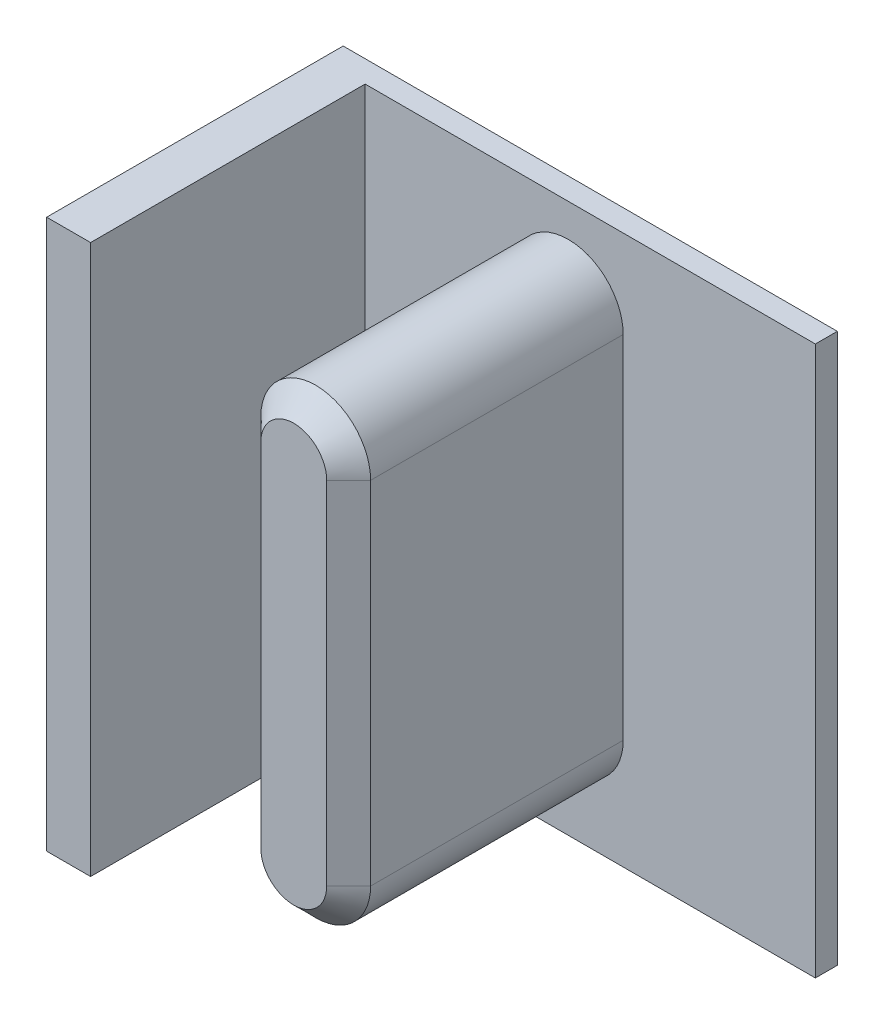
ISO-10303-21;
HEADER;
FILE_DESCRIPTION(('STEP AP214'),'2;1');
FILE_NAME('part.step','',(''),(''),'','','');
FILE_SCHEMA(('AUTOMOTIVE_DESIGN { 1 0 10303 214 1 1 1 1 }'));
ENDSEC;
DATA;
#1=APPLICATION_CONTEXT('core data for automotive mechanical design processes');
#2=APPLICATION_PROTOCOL_DEFINITION('international standard','automotive_design',2000,#1);
#3=PRODUCT_CONTEXT('',#1,'mechanical');
#4=PRODUCT('Part','Part','',(#3));
#5=PRODUCT_RELATED_PRODUCT_CATEGORY('part','',(#4));
#6=PRODUCT_DEFINITION_FORMATION('','',#4);
#7=PRODUCT_DEFINITION_CONTEXT('part definition',#1,'design');
#8=PRODUCT_DEFINITION('design','',#6,#7);
#9=PRODUCT_DEFINITION_SHAPE('','',#8);
#10=(LENGTH_UNIT() NAMED_UNIT(*) SI_UNIT(.MILLI.,.METRE.));
#11=(NAMED_UNIT(*) PLANE_ANGLE_UNIT() SI_UNIT($,.RADIAN.));
#12=(NAMED_UNIT(*) SI_UNIT($,.STERADIAN.) SOLID_ANGLE_UNIT());
#13=UNCERTAINTY_MEASURE_WITH_UNIT(LENGTH_MEASURE(1.E-05),#10,'distance_accuracy_value','');
#14=(GEOMETRIC_REPRESENTATION_CONTEXT(3) GLOBAL_UNCERTAINTY_ASSIGNED_CONTEXT((#13)) GLOBAL_UNIT_ASSIGNED_CONTEXT((#10,
#11,#12)) REPRESENTATION_CONTEXT('',''));
#15=CARTESIAN_POINT('',(0.,0.,0.));
#16=DIRECTION('',(0.,0.,1.));
#17=DIRECTION('',(1.,0.,0.));
#18=AXIS2_PLACEMENT_3D('',#15,#16,#17);
#19=CARTESIAN_POINT('',(0.,0.,0.4));
#20=DIRECTION('',(0.,0.,-1.));
#21=DIRECTION('',(-1.,0.,0.));
#22=AXIS2_PLACEMENT_3D('',#19,#20,#21);
#23=PLANE('',#22);
#24=CARTESIAN_POINT('',(4.5,2.,0.4));
#25=DIRECTION('',(0.,0.,1.));
#26=DIRECTION('',(1.,0.,0.));
#27=AXIS2_PLACEMENT_3D('',#24,#25,#26);
#28=CIRCLE('',#27,1.);
#29=CARTESIAN_POINT('',(3.5,2.,0.4));
#30=VERTEX_POINT('',#29);
#31=CARTESIAN_POINT('',(5.5,2.,0.4));
#32=VERTEX_POINT('',#31);
#33=EDGE_CURVE('E161',#30,#32,#28,.T.);
#34=ORIENTED_EDGE('',*,*,#33,.F.);
#35=DIRECTION('',(0.,-1.,0.));
#36=VECTOR('',#35,1.);
#37=CARTESIAN_POINT('',(3.5,2.,0.4));
#38=LINE('',#37,#36);
#39=CARTESIAN_POINT('',(3.5,8.4,0.4));
#40=VERTEX_POINT('',#39);
#41=EDGE_CURVE('E170',#40,#30,#38,.T.);
#42=ORIENTED_EDGE('',*,*,#41,.F.);
#43=CARTESIAN_POINT('',(4.5,8.4,0.4));
#44=DIRECTION('',(0.,0.,1.));
#45=DIRECTION('',(1.,0.,0.));
#46=AXIS2_PLACEMENT_3D('',#43,#44,#45);
#47=CIRCLE('',#46,1.);
#48=CARTESIAN_POINT('',(5.5,8.4,0.4));
#49=VERTEX_POINT('',#48);
#50=EDGE_CURVE('E167',#49,#40,#47,.T.);
#51=ORIENTED_EDGE('',*,*,#50,.F.);
#52=DIRECTION('',(0.,1.,0.));
#53=VECTOR('',#52,1.);
#54=CARTESIAN_POINT('',(5.5,2.,0.4));
#55=LINE('',#54,#53);
#56=EDGE_CURVE('E164',#32,#49,#55,.T.);
#57=ORIENTED_EDGE('',*,*,#56,.F.);
#58=EDGE_LOOP('',(#34,#42,#51,#57));
#59=FACE_BOUND('',#58,.T.);
#60=DIRECTION('',(0.,1.,0.));
#61=VECTOR('',#60,1.);
#62=CARTESIAN_POINT('',(0.8,10.,0.4));
#63=LINE('',#62,#61);
#64=CARTESIAN_POINT('',(0.800000000000001,0.,0.4));
#65=VERTEX_POINT('',#64);
#66=CARTESIAN_POINT('',(0.800000000000001,10.,0.4));
#67=VERTEX_POINT('',#66);
#68=EDGE_CURVE('E150',#65,#67,#63,.T.);
#69=ORIENTED_EDGE('',*,*,#68,.F.);
#70=DIRECTION('',(1.,0.,0.));
#71=VECTOR('',#70,1.);
#72=CARTESIAN_POINT('',(0.,0.,0.4));
#73=LINE('',#72,#71);
#74=CARTESIAN_POINT('',(9.,0.,0.4));
#75=VERTEX_POINT('',#74);
#76=EDGE_CURVE('E181',#65,#75,#73,.T.);
#77=ORIENTED_EDGE('',*,*,#76,.T.);
#78=DIRECTION('',(0.,1.,0.));
#79=VECTOR('',#78,1.);
#80=CARTESIAN_POINT('',(9.,0.,0.4));
#81=LINE('',#80,#79);
#82=CARTESIAN_POINT('',(9.,10.,0.4));
#83=VERTEX_POINT('',#82);
#84=EDGE_CURVE('E183',#75,#83,#81,.T.);
#85=ORIENTED_EDGE('',*,*,#84,.T.);
#86=DIRECTION('',(-1.,0.,0.));
#87=VECTOR('',#86,1.);
#88=CARTESIAN_POINT('',(0.,10.,0.4));
#89=LINE('',#88,#87);
#90=EDGE_CURVE('E186',#83,#67,#89,.T.);
#91=ORIENTED_EDGE('',*,*,#90,.T.);
#92=EDGE_LOOP('',(#69,#77,#85,#91));
#93=FACE_BOUND('',#92,.T.);
#94=ADVANCED_FACE('F33',(#59,#93),#23,.F.);
#95=CARTESIAN_POINT('',(0.,0.,0.4));
#96=DIRECTION('',(1.,0.,0.));
#97=DIRECTION('',(0.,0.,-1.));
#98=AXIS2_PLACEMENT_3D('',#95,#96,#97);
#99=PLANE('',#98);
#100=DIRECTION('',(0.,-1.,0.));
#101=VECTOR('',#100,1.);
#102=CARTESIAN_POINT('',(0.,0.,0.));
#103=LINE('',#102,#101);
#104=CARTESIAN_POINT('',(0.,10.,0.));
#105=VERTEX_POINT('',#104);
#106=CARTESIAN_POINT('',(0.,0.,0.));
#107=VERTEX_POINT('',#106);
#108=EDGE_CURVE('E131',#105,#107,#103,.T.);
#109=ORIENTED_EDGE('',*,*,#108,.T.);
#110=DIRECTION('',(0.,0.,-1.));
#111=VECTOR('',#110,1.);
#112=CARTESIAN_POINT('',(0.,0.,0.4));
#113=LINE('',#112,#111);
#114=CARTESIAN_POINT('',(0.,0.,5.4));
#115=VERTEX_POINT('',#114);
#116=EDGE_CURVE('E124',#115,#107,#113,.T.);
#117=ORIENTED_EDGE('',*,*,#116,.F.);
#118=DIRECTION('',(0.,-1.,0.));
#119=VECTOR('',#118,1.);
#120=CARTESIAN_POINT('',(0.,10.,5.4));
#121=LINE('',#120,#119);
#122=CARTESIAN_POINT('',(0.,10.,5.4));
#123=VERTEX_POINT('',#122);
#124=EDGE_CURVE('E129',#123,#115,#121,.T.);
#125=ORIENTED_EDGE('',*,*,#124,.F.);
#126=DIRECTION('',(0.,0.,-1.));
#127=VECTOR('',#126,1.);
#128=CARTESIAN_POINT('',(0.,10.,0.4));
#129=LINE('',#128,#127);
#130=EDGE_CURVE('E188',#123,#105,#129,.T.);
#131=ORIENTED_EDGE('',*,*,#130,.T.);
#132=EDGE_LOOP('',(#109,#117,#125,#131));
#133=FACE_BOUND('',#132,.T.);
#134=ADVANCED_FACE('F126',(#133),#99,.F.);
#135=CARTESIAN_POINT('',(0.,0.,0.4));
#136=DIRECTION('',(0.,1.,0.));
#137=DIRECTION('',(0.,0.,1.));
#138=AXIS2_PLACEMENT_3D('',#135,#136,#137);
#139=PLANE('',#138);
#140=DIRECTION('',(1.,0.,0.));
#141=VECTOR('',#140,1.);
#142=CARTESIAN_POINT('',(0.,0.,0.));
#143=LINE('',#142,#141);
#144=CARTESIAN_POINT('',(9.,0.,0.));
#145=VERTEX_POINT('',#144);
#146=EDGE_CURVE('E190',#107,#145,#143,.T.);
#147=ORIENTED_EDGE('',*,*,#146,.T.);
#148=DIRECTION('',(0.,0.,-1.));
#149=VECTOR('',#148,1.);
#150=CARTESIAN_POINT('',(9.,0.,0.4));
#151=LINE('',#150,#149);
#152=EDGE_CURVE('E134',#75,#145,#151,.T.);
#153=ORIENTED_EDGE('',*,*,#152,.F.);
#154=ORIENTED_EDGE('',*,*,#76,.F.);
#155=DIRECTION('',(0.,0.,-1.));
#156=VECTOR('',#155,1.);
#157=CARTESIAN_POINT('',(0.800000000000001,0.,5.4));
#158=LINE('',#157,#156);
#159=CARTESIAN_POINT('',(0.800000000000001,0.,5.4));
#160=VERTEX_POINT('',#159);
#161=EDGE_CURVE('E141',#160,#65,#158,.T.);
#162=ORIENTED_EDGE('',*,*,#161,.F.);
#163=DIRECTION('',(1.,0.,0.));
#164=VECTOR('',#163,1.);
#165=CARTESIAN_POINT('',(0.,0.,5.4));
#166=LINE('',#165,#164);
#167=EDGE_CURVE('E137',#115,#160,#166,.T.);
#168=ORIENTED_EDGE('',*,*,#167,.F.);
#169=ORIENTED_EDGE('',*,*,#116,.T.);
#170=EDGE_LOOP('',(#147,#153,#154,#162,#168,#169));
#171=FACE_BOUND('',#170,.T.);
#172=ADVANCED_FACE('F138',(#171),#139,.F.);
#173=CARTESIAN_POINT('',(9.,0.,0.4));
#174=DIRECTION('',(-1.,0.,0.));
#175=DIRECTION('',(0.,0.,1.));
#176=AXIS2_PLACEMENT_3D('',#173,#174,#175);
#177=PLANE('',#176);
#178=DIRECTION('',(0.,1.,0.));
#179=VECTOR('',#178,1.);
#180=CARTESIAN_POINT('',(9.,0.,0.));
#181=LINE('',#180,#179);
#182=CARTESIAN_POINT('',(9.,10.,0.));
#183=VERTEX_POINT('',#182);
#184=EDGE_CURVE('E192',#145,#183,#181,.T.);
#185=ORIENTED_EDGE('',*,*,#184,.T.);
#186=DIRECTION('',(0.,0.,-1.));
#187=VECTOR('',#186,1.);
#188=CARTESIAN_POINT('',(9.,10.,0.4));
#189=LINE('',#188,#187);
#190=EDGE_CURVE('E196',#83,#183,#189,.T.);
#191=ORIENTED_EDGE('',*,*,#190,.F.);
#192=ORIENTED_EDGE('',*,*,#84,.F.);
#193=ORIENTED_EDGE('',*,*,#152,.T.);
#194=EDGE_LOOP('',(#185,#191,#192,#193));
#195=FACE_BOUND('',#194,.T.);
#196=ADVANCED_FACE('F275',(#195),#177,.F.);
#197=CARTESIAN_POINT('',(0.,10.,0.4));
#198=DIRECTION('',(0.,-1.,0.));
#199=DIRECTION('',(0.,0.,-1.));
#200=AXIS2_PLACEMENT_3D('',#197,#198,#199);
#201=PLANE('',#200);
#202=DIRECTION('',(-1.,0.,0.));
#203=VECTOR('',#202,1.);
#204=CARTESIAN_POINT('',(0.,10.,0.));
#205=LINE('',#204,#203);
#206=EDGE_CURVE('E184',#183,#105,#205,.T.);
#207=ORIENTED_EDGE('',*,*,#206,.T.);
#208=ORIENTED_EDGE('',*,*,#130,.F.);
#209=DIRECTION('',(-1.,0.,0.));
#210=VECTOR('',#209,1.);
#211=CARTESIAN_POINT('',(0.,10.,5.4));
#212=LINE('',#211,#210);
#213=CARTESIAN_POINT('',(0.8,10.,5.4));
#214=VERTEX_POINT('',#213);
#215=EDGE_CURVE('E149',#214,#123,#212,.T.);
#216=ORIENTED_EDGE('',*,*,#215,.F.);
#217=DIRECTION('',(0.,0.,-1.));
#218=VECTOR('',#217,1.);
#219=CARTESIAN_POINT('',(0.8,10.,5.4));
#220=LINE('',#219,#218);
#221=EDGE_CURVE('E156',#214,#67,#220,.T.);
#222=ORIENTED_EDGE('',*,*,#221,.T.);
#223=ORIENTED_EDGE('',*,*,#90,.F.);
#224=ORIENTED_EDGE('',*,*,#190,.T.);
#225=EDGE_LOOP('',(#207,#208,#216,#222,#223,#224));
#226=FACE_BOUND('',#225,.T.);
#227=ADVANCED_FACE('F271',(#226),#201,.F.);
#228=CARTESIAN_POINT('',(0.,0.,0.));
#229=DIRECTION('',(0.,0.,-1.));
#230=DIRECTION('',(-1.,0.,0.));
#231=AXIS2_PLACEMENT_3D('',#228,#229,#230);
#232=PLANE('',#231);
#233=ORIENTED_EDGE('',*,*,#108,.F.);
#234=ORIENTED_EDGE('',*,*,#206,.F.);
#235=ORIENTED_EDGE('',*,*,#184,.F.);
#236=ORIENTED_EDGE('',*,*,#146,.F.);
#237=EDGE_LOOP('',(#233,#234,#235,#236));
#238=FACE_BOUND('',#237,.T.);
#239=ADVANCED_FACE('F268',(#238),#232,.T.);
#240=CARTESIAN_POINT('',(4.5,2.,5.4));
#241=DIRECTION('',(0.,0.,-1.));
#242=DIRECTION('',(-1.,0.,0.));
#243=AXIS2_PLACEMENT_3D('',#240,#241,#242);
#244=CYLINDRICAL_SURFACE('',#243,1.);
#245=DIRECTION('',(0.,0.,-1.));
#246=VECTOR('',#245,1.);
#247=CARTESIAN_POINT('',(5.5,2.,5.4));
#248=LINE('',#247,#246);
#249=CARTESIAN_POINT('',(5.5,2.,5.));
#250=VERTEX_POINT('',#249);
#251=EDGE_CURVE('E179',#250,#32,#248,.T.);
#252=ORIENTED_EDGE('',*,*,#251,.F.);
#253=CARTESIAN_POINT('',(4.5,2.,5.));
#254=DIRECTION('',(0.,0.,1.));
#255=DIRECTION('',(1.,0.,0.));
#256=AXIS2_PLACEMENT_3D('',#253,#254,#255);
#257=CIRCLE('',#256,1.);
#258=CARTESIAN_POINT('',(3.5,2.,5.));
#259=VERTEX_POINT('',#258);
#260=EDGE_CURVE('E11',#250,#259,#257,.F.);
#261=ORIENTED_EDGE('',*,*,#260,.T.);
#262=DIRECTION('',(0.,0.,-1.));
#263=VECTOR('',#262,1.);
#264=CARTESIAN_POINT('',(3.5,2.,5.4));
#265=LINE('',#264,#263);
#266=EDGE_CURVE('E173',#259,#30,#265,.T.);
#267=ORIENTED_EDGE('',*,*,#266,.T.);
#268=ORIENTED_EDGE('',*,*,#33,.T.);
#269=EDGE_LOOP('',(#252,#261,#267,#268));
#270=FACE_BOUND('',#269,.T.);
#271=ADVANCED_FACE('F235',(#270),#244,.T.);
#272=CARTESIAN_POINT('',(5.5,2.,5.4));
#273=DIRECTION('',(-1.,0.,0.));
#274=DIRECTION('',(0.,0.,1.));
#275=AXIS2_PLACEMENT_3D('',#272,#273,#274);
#276=PLANE('',#275);
#277=DIRECTION('',(0.,0.,-1.));
#278=VECTOR('',#277,1.);
#279=CARTESIAN_POINT('',(5.5,8.4,5.4));
#280=LINE('',#279,#278);
#281=CARTESIAN_POINT('',(5.5,8.4,5.));
#282=VERTEX_POINT('',#281);
#283=EDGE_CURVE('E177',#282,#49,#280,.T.);
#284=ORIENTED_EDGE('',*,*,#283,.F.);
#285=DIRECTION('',(0.,-1.,0.));
#286=VECTOR('',#285,1.);
#287=CARTESIAN_POINT('',(5.5,2.,5.));
#288=LINE('',#287,#286);
#289=EDGE_CURVE('E42',#282,#250,#288,.T.);
#290=ORIENTED_EDGE('',*,*,#289,.T.);
#291=ORIENTED_EDGE('',*,*,#251,.T.);
#292=ORIENTED_EDGE('',*,*,#56,.T.);
#293=EDGE_LOOP('',(#284,#290,#291,#292));
#294=FACE_BOUND('',#293,.T.);
#295=ADVANCED_FACE('F352',(#294),#276,.F.);
#296=CARTESIAN_POINT('',(4.5,8.4,5.4));
#297=DIRECTION('',(0.,0.,-1.));
#298=DIRECTION('',(-1.,0.,0.));
#299=AXIS2_PLACEMENT_3D('',#296,#297,#298);
#300=CYLINDRICAL_SURFACE('',#299,1.);
#301=DIRECTION('',(0.,0.,-1.));
#302=VECTOR('',#301,1.);
#303=CARTESIAN_POINT('',(3.5,8.4,5.4));
#304=LINE('',#303,#302);
#305=CARTESIAN_POINT('',(3.5,8.4,5.));
#306=VERTEX_POINT('',#305);
#307=EDGE_CURVE('E175',#306,#40,#304,.T.);
#308=ORIENTED_EDGE('',*,*,#307,.F.);
#309=CARTESIAN_POINT('',(4.5,8.4,5.));
#310=DIRECTION('',(0.,0.,1.));
#311=DIRECTION('',(1.,0.,0.));
#312=AXIS2_PLACEMENT_3D('',#309,#310,#311);
#313=CIRCLE('',#312,1.);
#314=EDGE_CURVE('E57',#306,#282,#313,.F.);
#315=ORIENTED_EDGE('',*,*,#314,.T.);
#316=ORIENTED_EDGE('',*,*,#283,.T.);
#317=ORIENTED_EDGE('',*,*,#50,.T.);
#318=EDGE_LOOP('',(#308,#315,#316,#317));
#319=FACE_BOUND('',#318,.T.);
#320=ADVANCED_FACE('F255',(#319),#300,.T.);
#321=CARTESIAN_POINT('',(3.5,2.,5.4));
#322=DIRECTION('',(1.,0.,0.));
#323=DIRECTION('',(0.,0.,-1.));
#324=AXIS2_PLACEMENT_3D('',#321,#322,#323);
#325=PLANE('',#324);
#326=ORIENTED_EDGE('',*,*,#266,.F.);
#327=DIRECTION('',(0.,1.,0.));
#328=VECTOR('',#327,1.);
#329=CARTESIAN_POINT('',(3.5,8.4,5.));
#330=LINE('',#329,#328);
#331=EDGE_CURVE('E209',#259,#306,#330,.T.);
#332=ORIENTED_EDGE('',*,*,#331,.T.);
#333=ORIENTED_EDGE('',*,*,#307,.T.);
#334=ORIENTED_EDGE('',*,*,#41,.T.);
#335=EDGE_LOOP('',(#326,#332,#333,#334));
#336=FACE_BOUND('',#335,.T.);
#337=ADVANCED_FACE('F239',(#336),#325,.F.);
#338=CARTESIAN_POINT('',(4.5,2.,5.4));
#339=DIRECTION('',(0.,0.,1.));
#340=DIRECTION('',(1.,0.,0.));
#341=AXIS2_PLACEMENT_3D('',#338,#339,#340);
#342=PLANE('',#341);
#343=CARTESIAN_POINT('',(4.5,8.4,5.4));
#344=DIRECTION('',(0.,0.,1.));
#345=DIRECTION('',(1.,0.,0.));
#346=AXIS2_PLACEMENT_3D('',#343,#344,#345);
#347=CIRCLE('',#346,0.599999999999998);
#348=CARTESIAN_POINT('',(5.1,8.4,5.4));
#349=VERTEX_POINT('',#348);
#350=CARTESIAN_POINT('',(3.9,8.4,5.4));
#351=VERTEX_POINT('',#350);
#352=EDGE_CURVE('E204',#349,#351,#347,.T.);
#353=ORIENTED_EDGE('',*,*,#352,.T.);
#354=DIRECTION('',(0.,-1.,0.));
#355=VECTOR('',#354,1.);
#356=CARTESIAN_POINT('',(3.9,2.,5.4));
#357=LINE('',#356,#355);
#358=CARTESIAN_POINT('',(3.9,2.,5.4));
#359=VERTEX_POINT('',#358);
#360=EDGE_CURVE('E206',#351,#359,#357,.T.);
#361=ORIENTED_EDGE('',*,*,#360,.T.);
#362=CARTESIAN_POINT('',(4.5,2.,5.4));
#363=DIRECTION('',(0.,0.,1.));
#364=DIRECTION('',(1.,0.,0.));
#365=AXIS2_PLACEMENT_3D('',#362,#363,#364);
#366=CIRCLE('',#365,0.599999999999998);
#367=CARTESIAN_POINT('',(5.1,2.,5.4));
#368=VERTEX_POINT('',#367);
#369=EDGE_CURVE('E133',#359,#368,#366,.T.);
#370=ORIENTED_EDGE('',*,*,#369,.T.);
#371=DIRECTION('',(0.,1.,0.));
#372=VECTOR('',#371,1.);
#373=CARTESIAN_POINT('',(5.1,8.4,5.4));
#374=LINE('',#373,#372);
#375=EDGE_CURVE('E202',#368,#349,#374,.T.);
#376=ORIENTED_EDGE('',*,*,#375,.T.);
#377=EDGE_LOOP('',(#353,#361,#370,#376));
#378=FACE_BOUND('',#377,.T.);
#379=ADVANCED_FACE('F245',(#378),#342,.T.);
#380=CARTESIAN_POINT('',(0.8,10.,5.4));
#381=DIRECTION('',(-1.,0.,0.));
#382=DIRECTION('',(0.,-1.,0.));
#383=AXIS2_PLACEMENT_3D('',#380,#381,#382);
#384=PLANE('',#383);
#385=ORIENTED_EDGE('',*,*,#68,.T.);
#386=ORIENTED_EDGE('',*,*,#221,.F.);
#387=DIRECTION('',(0.,1.,0.));
#388=VECTOR('',#387,1.);
#389=CARTESIAN_POINT('',(0.8,10.,5.4));
#390=LINE('',#389,#388);
#391=EDGE_CURVE('E144',#160,#214,#390,.T.);
#392=ORIENTED_EDGE('',*,*,#391,.F.);
#393=ORIENTED_EDGE('',*,*,#161,.T.);
#394=EDGE_LOOP('',(#385,#386,#392,#393));
#395=FACE_BOUND('',#394,.T.);
#396=ADVANCED_FACE('F247',(#395),#384,.F.);
#397=CARTESIAN_POINT('',(0.,0.,5.4));
#398=DIRECTION('',(0.,0.,1.));
#399=DIRECTION('',(1.,0.,0.));
#400=AXIS2_PLACEMENT_3D('',#397,#398,#399);
#401=PLANE('',#400);
#402=ORIENTED_EDGE('',*,*,#124,.T.);
#403=ORIENTED_EDGE('',*,*,#167,.T.);
#404=ORIENTED_EDGE('',*,*,#391,.T.);
#405=ORIENTED_EDGE('',*,*,#215,.T.);
#406=EDGE_LOOP('',(#402,#403,#404,#405));
#407=FACE_BOUND('',#406,.T.);
#408=ADVANCED_FACE('F147',(#407),#401,.T.);
#409=CARTESIAN_POINT('',(5.1,2.,5.4));
#410=DIRECTION('',(0.707106781186549,0.,0.707106781186546));
#411=DIRECTION('',(0.,-1.,0.));
#412=AXIS2_PLACEMENT_3D('',#409,#410,#411);
#413=PLANE('',#412);
#414=DIRECTION('',(-0.707106781186546,0.,0.707106781186549));
#415=VECTOR('',#414,1.);
#416=CARTESIAN_POINT('',(5.5,2.,5.));
#417=LINE('',#416,#415);
#418=EDGE_CURVE('E217',#250,#368,#417,.T.);
#419=ORIENTED_EDGE('',*,*,#418,.F.);
#420=ORIENTED_EDGE('',*,*,#289,.F.);
#421=DIRECTION('',(0.707106781186546,0.,-0.707106781186549));
#422=VECTOR('',#421,1.);
#423=CARTESIAN_POINT('',(5.1,8.4,5.4));
#424=LINE('',#423,#422);
#425=EDGE_CURVE('E37',#349,#282,#424,.T.);
#426=ORIENTED_EDGE('',*,*,#425,.F.);
#427=ORIENTED_EDGE('',*,*,#375,.F.);
#428=EDGE_LOOP('',(#419,#420,#426,#427));
#429=FACE_BOUND('',#428,.T.);
#430=ADVANCED_FACE('F35',(#429),#413,.T.);
#431=CARTESIAN_POINT('',(4.5,8.4,5.4));
#432=DIRECTION('',(0.,0.,-1.));
#433=DIRECTION('',(-1.,0.,0.));
#434=AXIS2_PLACEMENT_3D('',#431,#432,#433);
#435=CONICAL_SURFACE('',#434,0.599999999999998,0.785398163397446);
#436=ORIENTED_EDGE('',*,*,#425,.T.);
#437=ORIENTED_EDGE('',*,*,#314,.F.);
#438=DIRECTION('',(-0.707106781186546,0.,-0.707106781186549));
#439=VECTOR('',#438,1.);
#440=CARTESIAN_POINT('',(3.9,8.4,5.4));
#441=LINE('',#440,#439);
#442=EDGE_CURVE('E216',#351,#306,#441,.T.);
#443=ORIENTED_EDGE('',*,*,#442,.F.);
#444=ORIENTED_EDGE('',*,*,#352,.F.);
#445=EDGE_LOOP('',(#436,#437,#443,#444));
#446=FACE_BOUND('',#445,.T.);
#447=ADVANCED_FACE('F227',(#446),#435,.T.);
#448=CARTESIAN_POINT('',(4.5,2.,5.4));
#449=DIRECTION('',(0.,0.,-1.));
#450=DIRECTION('',(-1.,0.,0.));
#451=AXIS2_PLACEMENT_3D('',#448,#449,#450);
#452=CONICAL_SURFACE('',#451,0.599999999999998,0.785398163397446);
#453=ORIENTED_EDGE('',*,*,#418,.T.);
#454=ORIENTED_EDGE('',*,*,#369,.F.);
#455=DIRECTION('',(0.707106781186546,0.,0.707106781186549));
#456=VECTOR('',#455,1.);
#457=CARTESIAN_POINT('',(3.5,2.,5.));
#458=LINE('',#457,#456);
#459=EDGE_CURVE('E214',#259,#359,#458,.T.);
#460=ORIENTED_EDGE('',*,*,#459,.F.);
#461=ORIENTED_EDGE('',*,*,#260,.F.);
#462=EDGE_LOOP('',(#453,#454,#460,#461));
#463=FACE_BOUND('',#462,.T.);
#464=ADVANCED_FACE('F232',(#463),#452,.T.);
#465=CARTESIAN_POINT('',(3.9,2.,5.4));
#466=DIRECTION('',(-0.707106781186549,0.,0.707106781186546));
#467=DIRECTION('',(0.,1.,0.));
#468=AXIS2_PLACEMENT_3D('',#465,#466,#467);
#469=PLANE('',#468);
#470=ORIENTED_EDGE('',*,*,#442,.T.);
#471=ORIENTED_EDGE('',*,*,#331,.F.);
#472=ORIENTED_EDGE('',*,*,#459,.T.);
#473=ORIENTED_EDGE('',*,*,#360,.F.);
#474=EDGE_LOOP('',(#470,#471,#472,#473));
#475=FACE_BOUND('',#474,.T.);
#476=ADVANCED_FACE('F242',(#475),#469,.T.);
#477=CLOSED_SHELL('',(#94,#134,#172,#196,#227,#239,#271,#295,#320,#337,#379,#396,#408,#430,#447,
#464,#476));
#478=MANIFOLD_SOLID_BREP('B2',#477);
#479=ADVANCED_BREP_SHAPE_REPRESENTATION('',(#18,#478),#14);
#480=SHAPE_DEFINITION_REPRESENTATION(#9,#479);
ENDSEC;
END-ISO-10303-21;
